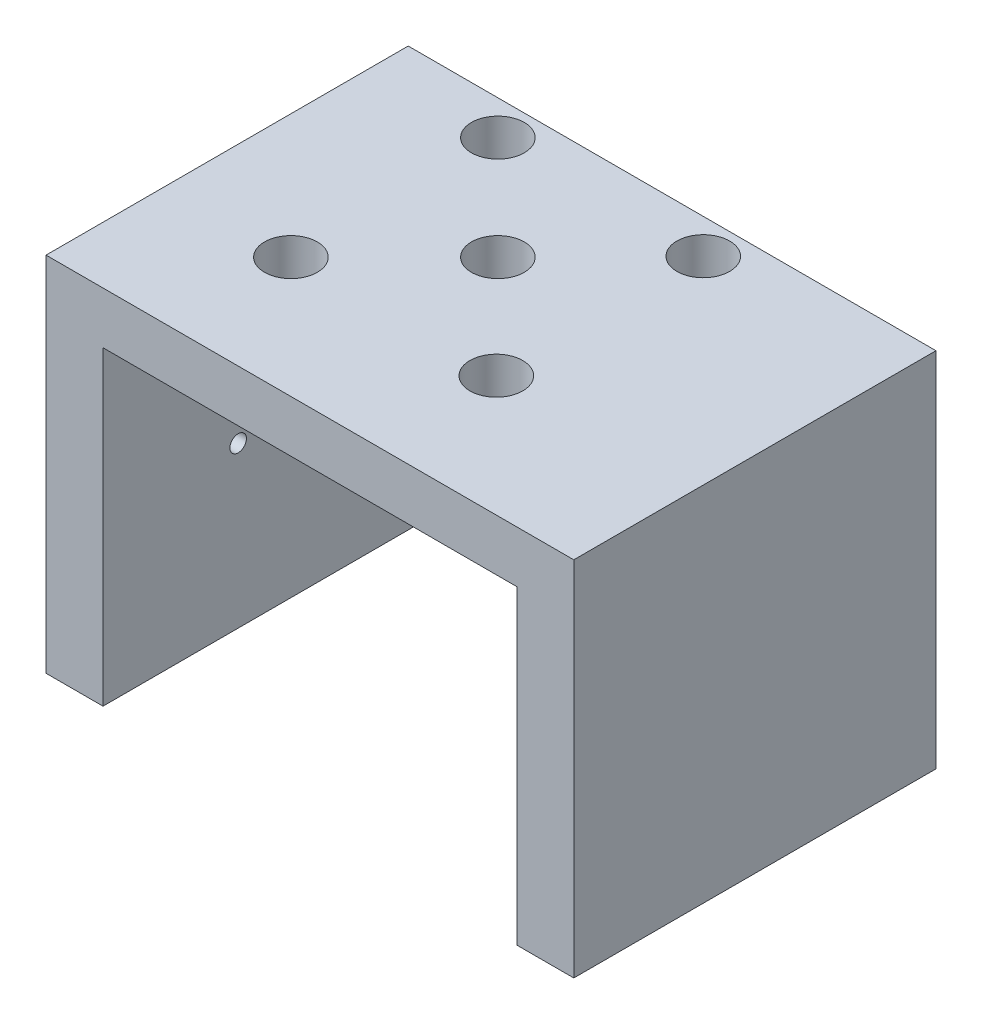
ISO-10303-21;
HEADER;
FILE_DESCRIPTION(('STEP AP214'),'2;1');
FILE_NAME('part.step','',(''),(''),'','','');
FILE_SCHEMA(('AUTOMOTIVE_DESIGN { 1 0 10303 214 1 1 1 1 }'));
ENDSEC;
DATA;
#1=APPLICATION_CONTEXT('core data for automotive mechanical design processes');
#2=APPLICATION_PROTOCOL_DEFINITION('international standard','automotive_design',2000,#1);
#3=PRODUCT_CONTEXT('',#1,'mechanical');
#4=PRODUCT('Part','Part','',(#3));
#5=PRODUCT_RELATED_PRODUCT_CATEGORY('part','',(#4));
#6=PRODUCT_DEFINITION_FORMATION('','',#4);
#7=PRODUCT_DEFINITION_CONTEXT('part definition',#1,'design');
#8=PRODUCT_DEFINITION('design','',#6,#7);
#9=PRODUCT_DEFINITION_SHAPE('','',#8);
#10=(LENGTH_UNIT() NAMED_UNIT(*) SI_UNIT(.MILLI.,.METRE.));
#11=(NAMED_UNIT(*) PLANE_ANGLE_UNIT() SI_UNIT($,.RADIAN.));
#12=(NAMED_UNIT(*) SI_UNIT($,.STERADIAN.) SOLID_ANGLE_UNIT());
#13=UNCERTAINTY_MEASURE_WITH_UNIT(LENGTH_MEASURE(1.E-05),#10,'distance_accuracy_value','');
#14=(GEOMETRIC_REPRESENTATION_CONTEXT(3) GLOBAL_UNCERTAINTY_ASSIGNED_CONTEXT((#13)) GLOBAL_UNIT_ASSIGNED_CONTEXT((#10,
#11,#12)) REPRESENTATION_CONTEXT('',''));
#15=CARTESIAN_POINT('',(0.,0.,0.));
#16=DIRECTION('',(0.,0.,1.));
#17=DIRECTION('',(1.,0.,0.));
#18=AXIS2_PLACEMENT_3D('',#15,#16,#17);
#19=CARTESIAN_POINT('',(0.,30.,-35.));
#20=DIRECTION('',(0.,-1.,0.));
#21=DIRECTION('',(1.,0.,0.));
#22=AXIS2_PLACEMENT_3D('',#19,#20,#21);
#23=PLANE('',#22);
#24=CARTESIAN_POINT('',(-19.15,30.,-31.6637750958536));
#25=DIRECTION('',(0.,-1.,0.));
#26=DIRECTION('',(1.,0.,0.));
#27=AXIS2_PLACEMENT_3D('',#24,#25,#26);
#28=CIRCLE('',#27,2.55);
#29=CARTESIAN_POINT('',(-16.6,30.,-31.6637750958536));
#30=VERTEX_POINT('',#29);
#31=EDGE_CURVE('E300',#30,#30,#28,.T.);
#32=ORIENTED_EDGE('',*,*,#31,.F.);
#33=EDGE_LOOP('',(#32));
#34=FACE_BOUND('',#33,.T.);
#35=CARTESIAN_POINT('',(-39.,30.,-11.6637750958536));
#36=DIRECTION('',(0.,-1.,0.));
#37=DIRECTION('',(1.,0.,0.));
#38=AXIS2_PLACEMENT_3D('',#35,#36,#37);
#39=CIRCLE('',#38,2.55);
#40=CARTESIAN_POINT('',(-36.45,30.,-11.6637750958536));
#41=VERTEX_POINT('',#40);
#42=EDGE_CURVE('E296',#41,#41,#39,.T.);
#43=ORIENTED_EDGE('',*,*,#42,.F.);
#44=EDGE_LOOP('',(#43));
#45=FACE_BOUND('',#44,.T.);
#46=CARTESIAN_POINT('',(-29.,30.,-21.6637750958536));
#47=DIRECTION('',(0.,-1.,0.));
#48=DIRECTION('',(1.,0.,0.));
#49=AXIS2_PLACEMENT_3D('',#46,#47,#48);
#50=CIRCLE('',#49,2.55);
#51=CARTESIAN_POINT('',(-26.45,30.,-21.6637750958536));
#52=VERTEX_POINT('',#51);
#53=EDGE_CURVE('E262',#52,#52,#50,.T.);
#54=ORIENTED_EDGE('',*,*,#53,.F.);
#55=EDGE_LOOP('',(#54));
#56=FACE_BOUND('',#55,.T.);
#57=CARTESIAN_POINT('',(-39.,30.,-31.6637750958536));
#58=DIRECTION('',(0.,-1.,0.));
#59=DIRECTION('',(1.,0.,0.));
#60=AXIS2_PLACEMENT_3D('',#57,#58,#59);
#61=CIRCLE('',#60,2.55);
#62=CARTESIAN_POINT('',(-36.45,30.,-31.6637750958536));
#63=VERTEX_POINT('',#62);
#64=EDGE_CURVE('E290',#63,#63,#61,.T.);
#65=ORIENTED_EDGE('',*,*,#64,.F.);
#66=EDGE_LOOP('',(#65));
#67=FACE_BOUND('',#66,.T.);
#68=CARTESIAN_POINT('',(-19.15,30.,-11.6637750958536));
#69=DIRECTION('',(0.,-1.,0.));
#70=DIRECTION('',(1.,0.,0.));
#71=AXIS2_PLACEMENT_3D('',#68,#69,#70);
#72=CIRCLE('',#71,2.55);
#73=CARTESIAN_POINT('',(-16.6,30.,-11.6637750958536));
#74=VERTEX_POINT('',#73);
#75=EDGE_CURVE('E286',#74,#74,#72,.T.);
#76=ORIENTED_EDGE('',*,*,#75,.F.);
#77=EDGE_LOOP('',(#76));
#78=FACE_BOUND('',#77,.T.);
#79=DIRECTION('',(1.,0.,0.));
#80=VECTOR('',#79,1.);
#81=CARTESIAN_POINT('',(0.,30.,0.));
#82=LINE('',#81,#80);
#83=CARTESIAN_POINT('',(-45.4950995451822,30.,0.));
#84=VERTEX_POINT('',#83);
#85=CARTESIAN_POINT('',(-5.49509954518222,30.,0.));
#86=VERTEX_POINT('',#85);
#87=EDGE_CURVE('E144',#84,#86,#82,.T.);
#88=ORIENTED_EDGE('',*,*,#87,.F.);
#89=DIRECTION('',(0.,0.,1.));
#90=VECTOR('',#89,1.);
#91=CARTESIAN_POINT('',(-45.4950995451822,30.,-35.));
#92=LINE('',#91,#90);
#93=CARTESIAN_POINT('',(-45.4950995451822,30.,-35.));
#94=VERTEX_POINT('',#93);
#95=EDGE_CURVE('E11',#94,#84,#92,.T.);
#96=ORIENTED_EDGE('',*,*,#95,.F.);
#97=DIRECTION('',(1.,0.,0.));
#98=VECTOR('',#97,1.);
#99=CARTESIAN_POINT('',(0.,30.,-35.));
#100=LINE('',#99,#98);
#101=CARTESIAN_POINT('',(-5.49509954518222,30.,-35.));
#102=VERTEX_POINT('',#101);
#103=EDGE_CURVE('E173',#94,#102,#100,.T.);
#104=ORIENTED_EDGE('',*,*,#103,.T.);
#105=DIRECTION('',(0.,0.,1.));
#106=VECTOR('',#105,1.);
#107=CARTESIAN_POINT('',(-5.49509954518222,30.,-35.));
#108=LINE('',#107,#106);
#109=EDGE_CURVE('E47',#102,#86,#108,.T.);
#110=ORIENTED_EDGE('',*,*,#109,.T.);
#111=EDGE_LOOP('',(#88,#96,#104,#110));
#112=FACE_BOUND('',#111,.T.);
#113=ADVANCED_FACE('F44',(#34,#45,#56,#67,#78,#112),#23,.T.);
#114=CARTESIAN_POINT('',(-45.4950995451822,0.,-35.));
#115=DIRECTION('',(1.,0.,0.));
#116=DIRECTION('',(0.,1.,0.));
#117=AXIS2_PLACEMENT_3D('',#114,#115,#116);
#118=PLANE('',#117);
#119=CARTESIAN_POINT('',(-45.4950995451822,15.4747116234191,-13.0633207160786));
#120=DIRECTION('',(1.,0.,0.));
#121=DIRECTION('',(0.,1.,0.));
#122=AXIS2_PLACEMENT_3D('',#119,#120,#121);
#123=CIRCLE('',#122,0.8);
#124=CARTESIAN_POINT('',(-45.4950995451822,16.2747116234191,-13.0633207160786));
#125=VERTEX_POINT('',#124);
#126=EDGE_CURVE('E149',#125,#125,#123,.T.);
#127=ORIENTED_EDGE('',*,*,#126,.F.);
#128=EDGE_LOOP('',(#127));
#129=FACE_BOUND('',#128,.T.);
#130=CARTESIAN_POINT('',(-45.4950995451822,15.4747116234191,-22.0633207160786));
#131=DIRECTION('',(1.,0.,0.));
#132=DIRECTION('',(0.,1.,0.));
#133=AXIS2_PLACEMENT_3D('',#130,#131,#132);
#134=CIRCLE('',#133,0.799999999999999);
#135=CARTESIAN_POINT('',(-45.4950995451822,16.2747116234191,-22.0633207160786));
#136=VERTEX_POINT('',#135);
#137=EDGE_CURVE('E309',#136,#136,#134,.T.);
#138=ORIENTED_EDGE('',*,*,#137,.F.);
#139=EDGE_LOOP('',(#138));
#140=FACE_BOUND('',#139,.T.);
#141=DIRECTION('',(0.,1.,0.));
#142=VECTOR('',#141,1.);
#143=CARTESIAN_POINT('',(-45.4950995451822,0.,0.));
#144=LINE('',#143,#142);
#145=CARTESIAN_POINT('',(-45.4950995451822,0.,0.));
#146=VERTEX_POINT('',#145);
#147=EDGE_CURVE('E170',#146,#84,#144,.T.);
#148=ORIENTED_EDGE('',*,*,#147,.F.);
#149=DIRECTION('',(0.,0.,1.));
#150=VECTOR('',#149,1.);
#151=CARTESIAN_POINT('',(-45.4950995451822,0.,-35.));
#152=LINE('',#151,#150);
#153=CARTESIAN_POINT('',(-45.4950995451822,0.,-35.));
#154=VERTEX_POINT('',#153);
#155=EDGE_CURVE('E54',#154,#146,#152,.T.);
#156=ORIENTED_EDGE('',*,*,#155,.F.);
#157=DIRECTION('',(0.,1.,0.));
#158=VECTOR('',#157,1.);
#159=CARTESIAN_POINT('',(-45.4950995451822,0.,-35.));
#160=LINE('',#159,#158);
#161=EDGE_CURVE('E137',#154,#94,#160,.T.);
#162=ORIENTED_EDGE('',*,*,#161,.T.);
#163=ORIENTED_EDGE('',*,*,#95,.T.);
#164=EDGE_LOOP('',(#148,#156,#162,#163));
#165=FACE_BOUND('',#164,.T.);
#166=ADVANCED_FACE('F192',(#129,#140,#165),#118,.T.);
#167=CARTESIAN_POINT('',(0.,0.,-35.));
#168=DIRECTION('',(0.,-1.,0.));
#169=DIRECTION('',(1.,0.,0.));
#170=AXIS2_PLACEMENT_3D('',#167,#168,#169);
#171=PLANE('',#170);
#172=DIRECTION('',(1.,0.,0.));
#173=VECTOR('',#172,1.);
#174=CARTESIAN_POINT('',(0.,0.,0.));
#175=LINE('',#174,#173);
#176=CARTESIAN_POINT('',(-51.,0.,0.));
#177=VERTEX_POINT('',#176);
#178=EDGE_CURVE('E120',#177,#146,#175,.T.);
#179=ORIENTED_EDGE('',*,*,#178,.F.);
#180=DIRECTION('',(0.,0.,1.));
#181=VECTOR('',#180,1.);
#182=CARTESIAN_POINT('',(-51.,0.,-35.));
#183=LINE('',#182,#181);
#184=CARTESIAN_POINT('',(-51.,0.,-35.));
#185=VERTEX_POINT('',#184);
#186=EDGE_CURVE('E114',#185,#177,#183,.T.);
#187=ORIENTED_EDGE('',*,*,#186,.F.);
#188=DIRECTION('',(1.,0.,0.));
#189=VECTOR('',#188,1.);
#190=CARTESIAN_POINT('',(0.,0.,-35.));
#191=LINE('',#190,#189);
#192=EDGE_CURVE('E118',#185,#154,#191,.T.);
#193=ORIENTED_EDGE('',*,*,#192,.T.);
#194=ORIENTED_EDGE('',*,*,#155,.T.);
#195=EDGE_LOOP('',(#179,#187,#193,#194));
#196=FACE_BOUND('',#195,.T.);
#197=ADVANCED_FACE('F116',(#196),#171,.T.);
#198=CARTESIAN_POINT('',(-51.,0.,-35.));
#199=DIRECTION('',(1.,0.,0.));
#200=DIRECTION('',(0.,0.,-1.));
#201=AXIS2_PLACEMENT_3D('',#198,#199,#200);
#202=PLANE('',#201);
#203=CARTESIAN_POINT('',(-51.,15.4747116234191,-13.0633207160786));
#204=DIRECTION('',(-1.,0.,0.));
#205=DIRECTION('',(0.,0.,1.));
#206=AXIS2_PLACEMENT_3D('',#203,#204,#205);
#207=CIRCLE('',#206,0.8);
#208=CARTESIAN_POINT('',(-51.,15.4747116234191,-12.2633207160786));
#209=VERTEX_POINT('',#208);
#210=EDGE_CURVE('E305',#209,#209,#207,.T.);
#211=ORIENTED_EDGE('',*,*,#210,.F.);
#212=EDGE_LOOP('',(#211));
#213=FACE_BOUND('',#212,.T.);
#214=CARTESIAN_POINT('',(-51.,15.4747116234191,-22.0633207160786));
#215=DIRECTION('',(-1.,0.,0.));
#216=DIRECTION('',(0.,0.,1.));
#217=AXIS2_PLACEMENT_3D('',#214,#215,#216);
#218=CIRCLE('',#217,0.799999999999999);
#219=CARTESIAN_POINT('',(-51.,15.4747116234191,-21.2633207160786));
#220=VERTEX_POINT('',#219);
#221=EDGE_CURVE('E304',#220,#220,#218,.T.);
#222=ORIENTED_EDGE('',*,*,#221,.F.);
#223=EDGE_LOOP('',(#222));
#224=FACE_BOUND('',#223,.T.);
#225=DIRECTION('',(0.,1.,0.));
#226=VECTOR('',#225,1.);
#227=CARTESIAN_POINT('',(-51.,0.,0.));
#228=LINE('',#227,#226);
#229=CARTESIAN_POINT('',(-51.,35.,0.));
#230=VERTEX_POINT('',#229);
#231=EDGE_CURVE('E165',#177,#230,#228,.T.);
#232=ORIENTED_EDGE('',*,*,#231,.T.);
#233=DIRECTION('',(0.,0.,1.));
#234=VECTOR('',#233,1.);
#235=CARTESIAN_POINT('',(-51.,35.,-35.));
#236=LINE('',#235,#234);
#237=CARTESIAN_POINT('',(-51.,35.,-35.));
#238=VERTEX_POINT('',#237);
#239=EDGE_CURVE('E125',#238,#230,#236,.T.);
#240=ORIENTED_EDGE('',*,*,#239,.F.);
#241=DIRECTION('',(0.,1.,0.));
#242=VECTOR('',#241,1.);
#243=CARTESIAN_POINT('',(-51.,0.,-35.));
#244=LINE('',#243,#242);
#245=EDGE_CURVE('E128',#185,#238,#244,.T.);
#246=ORIENTED_EDGE('',*,*,#245,.F.);
#247=ORIENTED_EDGE('',*,*,#186,.T.);
#248=EDGE_LOOP('',(#232,#240,#246,#247));
#249=FACE_BOUND('',#248,.T.);
#250=ADVANCED_FACE('F129',(#213,#224,#249),#202,.F.);
#251=CARTESIAN_POINT('',(0.,35.,-35.));
#252=DIRECTION('',(0.,1.,0.));
#253=DIRECTION('',(-1.,0.,0.));
#254=AXIS2_PLACEMENT_3D('',#251,#252,#253);
#255=PLANE('',#254);
#256=CARTESIAN_POINT('',(-19.15,35.,-31.6637750958536));
#257=DIRECTION('',(0.,1.,0.));
#258=DIRECTION('',(-1.,0.,0.));
#259=AXIS2_PLACEMENT_3D('',#256,#257,#258);
#260=CIRCLE('',#259,2.55);
#261=CARTESIAN_POINT('',(-21.7,35.,-31.6637750958536));
#262=VERTEX_POINT('',#261);
#263=EDGE_CURVE('E274',#262,#262,#260,.T.);
#264=ORIENTED_EDGE('',*,*,#263,.F.);
#265=EDGE_LOOP('',(#264));
#266=FACE_BOUND('',#265,.T.);
#267=CARTESIAN_POINT('',(-39.,35.,-11.6637750958536));
#268=DIRECTION('',(0.,1.,0.));
#269=DIRECTION('',(-1.,0.,0.));
#270=AXIS2_PLACEMENT_3D('',#267,#268,#269);
#271=CIRCLE('',#270,2.55);
#272=CARTESIAN_POINT('',(-41.55,35.,-11.6637750958536));
#273=VERTEX_POINT('',#272);
#274=EDGE_CURVE('E268',#273,#273,#271,.T.);
#275=ORIENTED_EDGE('',*,*,#274,.F.);
#276=EDGE_LOOP('',(#275));
#277=FACE_BOUND('',#276,.T.);
#278=CARTESIAN_POINT('',(-29.,35.,-21.6637750958536));
#279=DIRECTION('',(0.,1.,0.));
#280=DIRECTION('',(-1.,0.,0.));
#281=AXIS2_PLACEMENT_3D('',#278,#279,#280);
#282=CIRCLE('',#281,2.55);
#283=CARTESIAN_POINT('',(-31.55,35.,-21.6637750958536));
#284=VERTEX_POINT('',#283);
#285=EDGE_CURVE('E265',#284,#284,#282,.T.);
#286=ORIENTED_EDGE('',*,*,#285,.F.);
#287=EDGE_LOOP('',(#286));
#288=FACE_BOUND('',#287,.T.);
#289=CARTESIAN_POINT('',(-39.,35.,-31.6637750958536));
#290=DIRECTION('',(0.,1.,0.));
#291=DIRECTION('',(-1.,0.,0.));
#292=AXIS2_PLACEMENT_3D('',#289,#290,#291);
#293=CIRCLE('',#292,2.55);
#294=CARTESIAN_POINT('',(-41.55,35.,-31.6637750958536));
#295=VERTEX_POINT('',#294);
#296=EDGE_CURVE('E269',#295,#295,#293,.T.);
#297=ORIENTED_EDGE('',*,*,#296,.F.);
#298=EDGE_LOOP('',(#297));
#299=FACE_BOUND('',#298,.T.);
#300=CARTESIAN_POINT('',(-19.15,35.,-11.6637750958536));
#301=DIRECTION('',(0.,1.,0.));
#302=DIRECTION('',(-1.,0.,0.));
#303=AXIS2_PLACEMENT_3D('',#300,#301,#302);
#304=CIRCLE('',#303,2.55);
#305=CARTESIAN_POINT('',(-21.7,35.,-11.6637750958536));
#306=VERTEX_POINT('',#305);
#307=EDGE_CURVE('E281',#306,#306,#304,.T.);
#308=ORIENTED_EDGE('',*,*,#307,.F.);
#309=EDGE_LOOP('',(#308));
#310=FACE_BOUND('',#309,.T.);
#311=DIRECTION('',(-1.,0.,0.));
#312=VECTOR('',#311,1.);
#313=CARTESIAN_POINT('',(0.,35.,0.));
#314=LINE('',#313,#312);
#315=CARTESIAN_POINT('',(0.,35.,0.));
#316=VERTEX_POINT('',#315);
#317=EDGE_CURVE('E161',#316,#230,#314,.T.);
#318=ORIENTED_EDGE('',*,*,#317,.F.);
#319=DIRECTION('',(0.,0.,1.));
#320=VECTOR('',#319,1.);
#321=CARTESIAN_POINT('',(0.,35.,-35.));
#322=LINE('',#321,#320);
#323=CARTESIAN_POINT('',(0.,35.,-35.));
#324=VERTEX_POINT('',#323);
#325=EDGE_CURVE('E179',#324,#316,#322,.T.);
#326=ORIENTED_EDGE('',*,*,#325,.F.);
#327=DIRECTION('',(-1.,0.,0.));
#328=VECTOR('',#327,1.);
#329=CARTESIAN_POINT('',(0.,35.,-35.));
#330=LINE('',#329,#328);
#331=EDGE_CURVE('E134',#324,#238,#330,.T.);
#332=ORIENTED_EDGE('',*,*,#331,.T.);
#333=ORIENTED_EDGE('',*,*,#239,.T.);
#334=EDGE_LOOP('',(#318,#326,#332,#333));
#335=FACE_BOUND('',#334,.T.);
#336=ADVANCED_FACE('F210',(#266,#277,#288,#299,#310,#335),#255,.T.);
#337=CARTESIAN_POINT('',(0.,0.,-35.));
#338=DIRECTION('',(1.,0.,0.));
#339=DIRECTION('',(0.,0.,-1.));
#340=AXIS2_PLACEMENT_3D('',#337,#338,#339);
#341=PLANE('',#340);
#342=DIRECTION('',(0.,1.,0.));
#343=VECTOR('',#342,1.);
#344=CARTESIAN_POINT('',(0.,0.,0.));
#345=LINE('',#344,#343);
#346=CARTESIAN_POINT('',(0.,0.,0.));
#347=VERTEX_POINT('',#346);
#348=EDGE_CURVE('E157',#347,#316,#345,.T.);
#349=ORIENTED_EDGE('',*,*,#348,.F.);
#350=DIRECTION('',(0.,0.,1.));
#351=VECTOR('',#350,1.);
#352=CARTESIAN_POINT('',(0.,0.,-35.));
#353=LINE('',#352,#351);
#354=CARTESIAN_POINT('',(0.,0.,-35.));
#355=VERTEX_POINT('',#354);
#356=EDGE_CURVE('E182',#355,#347,#353,.T.);
#357=ORIENTED_EDGE('',*,*,#356,.F.);
#358=DIRECTION('',(0.,1.,0.));
#359=VECTOR('',#358,1.);
#360=CARTESIAN_POINT('',(0.,0.,-35.));
#361=LINE('',#360,#359);
#362=EDGE_CURVE('E327',#355,#324,#361,.T.);
#363=ORIENTED_EDGE('',*,*,#362,.T.);
#364=ORIENTED_EDGE('',*,*,#325,.T.);
#365=EDGE_LOOP('',(#349,#357,#363,#364));
#366=FACE_BOUND('',#365,.T.);
#367=ADVANCED_FACE('F214',(#366),#341,.T.);
#368=CARTESIAN_POINT('',(0.,0.,-35.));
#369=DIRECTION('',(0.,1.,0.));
#370=DIRECTION('',(-1.,0.,0.));
#371=AXIS2_PLACEMENT_3D('',#368,#369,#370);
#372=PLANE('',#371);
#373=DIRECTION('',(-1.,0.,0.));
#374=VECTOR('',#373,1.);
#375=CARTESIAN_POINT('',(0.,0.,0.));
#376=LINE('',#375,#374);
#377=CARTESIAN_POINT('',(-5.49509954518221,0.,0.));
#378=VERTEX_POINT('',#377);
#379=EDGE_CURVE('E153',#347,#378,#376,.T.);
#380=ORIENTED_EDGE('',*,*,#379,.T.);
#381=DIRECTION('',(0.,0.,1.));
#382=VECTOR('',#381,1.);
#383=CARTESIAN_POINT('',(-5.49509954518221,0.,-35.));
#384=LINE('',#383,#382);
#385=CARTESIAN_POINT('',(-5.49509954518221,0.,-35.));
#386=VERTEX_POINT('',#385);
#387=EDGE_CURVE('E184',#386,#378,#384,.T.);
#388=ORIENTED_EDGE('',*,*,#387,.F.);
#389=DIRECTION('',(-1.,0.,0.));
#390=VECTOR('',#389,1.);
#391=CARTESIAN_POINT('',(0.,0.,-35.));
#392=LINE('',#391,#390);
#393=EDGE_CURVE('E324',#355,#386,#392,.T.);
#394=ORIENTED_EDGE('',*,*,#393,.F.);
#395=ORIENTED_EDGE('',*,*,#356,.T.);
#396=EDGE_LOOP('',(#380,#388,#394,#395));
#397=FACE_BOUND('',#396,.T.);
#398=ADVANCED_FACE('F218',(#397),#372,.F.);
#399=CARTESIAN_POINT('',(-5.49509954518221,0.,-35.));
#400=DIRECTION('',(-1.,0.,0.));
#401=DIRECTION('',(0.,-1.,0.));
#402=AXIS2_PLACEMENT_3D('',#399,#400,#401);
#403=PLANE('',#402);
#404=DIRECTION('',(0.,-1.,0.));
#405=VECTOR('',#404,1.);
#406=CARTESIAN_POINT('',(-5.49509954518221,0.,0.));
#407=LINE('',#406,#405);
#408=EDGE_CURVE('E148',#86,#378,#407,.T.);
#409=ORIENTED_EDGE('',*,*,#408,.F.);
#410=ORIENTED_EDGE('',*,*,#109,.F.);
#411=DIRECTION('',(0.,-1.,0.));
#412=VECTOR('',#411,1.);
#413=CARTESIAN_POINT('',(-5.49509954518221,0.,-35.));
#414=LINE('',#413,#412);
#415=EDGE_CURVE('E321',#102,#386,#414,.T.);
#416=ORIENTED_EDGE('',*,*,#415,.T.);
#417=ORIENTED_EDGE('',*,*,#387,.T.);
#418=EDGE_LOOP('',(#409,#410,#416,#417));
#419=FACE_BOUND('',#418,.T.);
#420=ADVANCED_FACE('F188',(#419),#403,.T.);
#421=CARTESIAN_POINT('',(0.,0.,-35.));
#422=DIRECTION('',(0.,0.,1.));
#423=DIRECTION('',(1.,0.,0.));
#424=AXIS2_PLACEMENT_3D('',#421,#422,#423);
#425=PLANE('',#424);
#426=ORIENTED_EDGE('',*,*,#103,.F.);
#427=ORIENTED_EDGE('',*,*,#161,.F.);
#428=ORIENTED_EDGE('',*,*,#192,.F.);
#429=ORIENTED_EDGE('',*,*,#245,.T.);
#430=ORIENTED_EDGE('',*,*,#331,.F.);
#431=ORIENTED_EDGE('',*,*,#362,.F.);
#432=ORIENTED_EDGE('',*,*,#393,.T.);
#433=ORIENTED_EDGE('',*,*,#415,.F.);
#434=EDGE_LOOP('',(#426,#427,#428,#429,#430,#431,#432,#433));
#435=FACE_BOUND('',#434,.T.);
#436=ADVANCED_FACE('F136',(#435),#425,.F.);
#437=CARTESIAN_POINT('',(0.,0.,0.));
#438=DIRECTION('',(0.,0.,1.));
#439=DIRECTION('',(1.,0.,0.));
#440=AXIS2_PLACEMENT_3D('',#437,#438,#439);
#441=PLANE('',#440);
#442=ORIENTED_EDGE('',*,*,#87,.T.);
#443=ORIENTED_EDGE('',*,*,#408,.T.);
#444=ORIENTED_EDGE('',*,*,#379,.F.);
#445=ORIENTED_EDGE('',*,*,#348,.T.);
#446=ORIENTED_EDGE('',*,*,#317,.T.);
#447=ORIENTED_EDGE('',*,*,#231,.F.);
#448=ORIENTED_EDGE('',*,*,#178,.T.);
#449=ORIENTED_EDGE('',*,*,#147,.T.);
#450=EDGE_LOOP('',(#442,#443,#444,#445,#446,#447,#448,#449));
#451=FACE_BOUND('',#450,.T.);
#452=ADVANCED_FACE('F191',(#451),#441,.T.);
#453=CARTESIAN_POINT('',(-45.,15.4747116234191,-22.0633207160786));
#454=DIRECTION('',(-1.,0.,0.));
#455=DIRECTION('',(0.,0.,1.));
#456=AXIS2_PLACEMENT_3D('',#453,#454,#455);
#457=CYLINDRICAL_SURFACE('',#456,0.799999999999999);
#458=ORIENTED_EDGE('',*,*,#137,.T.);
#459=EDGE_LOOP('',(#458));
#460=FACE_BOUND('',#459,.T.);
#461=ORIENTED_EDGE('',*,*,#221,.T.);
#462=EDGE_LOOP('',(#461));
#463=FACE_BOUND('',#462,.T.);
#464=ADVANCED_FACE('F229',(#460,#463),#457,.F.);
#465=CARTESIAN_POINT('',(-45.,15.4747116234191,-13.0633207160786));
#466=DIRECTION('',(-1.,0.,0.));
#467=DIRECTION('',(0.,0.,1.));
#468=AXIS2_PLACEMENT_3D('',#465,#466,#467);
#469=CYLINDRICAL_SURFACE('',#468,0.8);
#470=ORIENTED_EDGE('',*,*,#126,.T.);
#471=EDGE_LOOP('',(#470));
#472=FACE_BOUND('',#471,.T.);
#473=ORIENTED_EDGE('',*,*,#210,.T.);
#474=EDGE_LOOP('',(#473));
#475=FACE_BOUND('',#474,.T.);
#476=ADVANCED_FACE('F233',(#472,#475),#469,.F.);
#477=CARTESIAN_POINT('',(-19.15,29.,-11.6637750958536));
#478=DIRECTION('',(0.,1.,0.));
#479=DIRECTION('',(-1.,0.,0.));
#480=AXIS2_PLACEMENT_3D('',#477,#478,#479);
#481=CYLINDRICAL_SURFACE('',#480,2.55);
#482=ORIENTED_EDGE('',*,*,#75,.T.);
#483=EDGE_LOOP('',(#482));
#484=FACE_BOUND('',#483,.T.);
#485=ORIENTED_EDGE('',*,*,#307,.T.);
#486=EDGE_LOOP('',(#485));
#487=FACE_BOUND('',#486,.T.);
#488=ADVANCED_FACE('F237',(#484,#487),#481,.F.);
#489=CARTESIAN_POINT('',(-39.,29.,-31.6637750958536));
#490=DIRECTION('',(0.,1.,0.));
#491=DIRECTION('',(-1.,0.,0.));
#492=AXIS2_PLACEMENT_3D('',#489,#490,#491);
#493=CYLINDRICAL_SURFACE('',#492,2.55);
#494=ORIENTED_EDGE('',*,*,#64,.T.);
#495=EDGE_LOOP('',(#494));
#496=FACE_BOUND('',#495,.T.);
#497=ORIENTED_EDGE('',*,*,#296,.T.);
#498=EDGE_LOOP('',(#497));
#499=FACE_BOUND('',#498,.T.);
#500=ADVANCED_FACE('F241',(#496,#499),#493,.F.);
#501=CARTESIAN_POINT('',(-29.,29.,-21.6637750958536));
#502=DIRECTION('',(0.,1.,0.));
#503=DIRECTION('',(-1.,0.,0.));
#504=AXIS2_PLACEMENT_3D('',#501,#502,#503);
#505=CYLINDRICAL_SURFACE('',#504,2.55);
#506=ORIENTED_EDGE('',*,*,#53,.T.);
#507=EDGE_LOOP('',(#506));
#508=FACE_BOUND('',#507,.T.);
#509=ORIENTED_EDGE('',*,*,#285,.T.);
#510=EDGE_LOOP('',(#509));
#511=FACE_BOUND('',#510,.T.);
#512=ADVANCED_FACE('F247',(#508,#511),#505,.F.);
#513=CARTESIAN_POINT('',(-39.,29.,-11.6637750958536));
#514=DIRECTION('',(0.,1.,0.));
#515=DIRECTION('',(-1.,0.,0.));
#516=AXIS2_PLACEMENT_3D('',#513,#514,#515);
#517=CYLINDRICAL_SURFACE('',#516,2.55);
#518=ORIENTED_EDGE('',*,*,#42,.T.);
#519=EDGE_LOOP('',(#518));
#520=FACE_BOUND('',#519,.T.);
#521=ORIENTED_EDGE('',*,*,#274,.T.);
#522=EDGE_LOOP('',(#521));
#523=FACE_BOUND('',#522,.T.);
#524=ADVANCED_FACE('F243',(#520,#523),#517,.F.);
#525=CARTESIAN_POINT('',(-19.15,29.,-31.6637750958536));
#526=DIRECTION('',(0.,1.,0.));
#527=DIRECTION('',(-1.,0.,0.));
#528=AXIS2_PLACEMENT_3D('',#525,#526,#527);
#529=CYLINDRICAL_SURFACE('',#528,2.55);
#530=ORIENTED_EDGE('',*,*,#31,.T.);
#531=EDGE_LOOP('',(#530));
#532=FACE_BOUND('',#531,.T.);
#533=ORIENTED_EDGE('',*,*,#263,.T.);
#534=EDGE_LOOP('',(#533));
#535=FACE_BOUND('',#534,.T.);
#536=ADVANCED_FACE('F246',(#532,#535),#529,.F.);
#537=CLOSED_SHELL('',(#113,#166,#197,#250,#336,#367,#398,#420,#436,#452,#464,#476,#488,#500,
#512,#524,#536));
#538=MANIFOLD_SOLID_BREP('B2',#537);
#539=ADVANCED_BREP_SHAPE_REPRESENTATION('',(#18,#538),#14);
#540=SHAPE_DEFINITION_REPRESENTATION(#9,#539);
ENDSEC;
END-ISO-10303-21;
